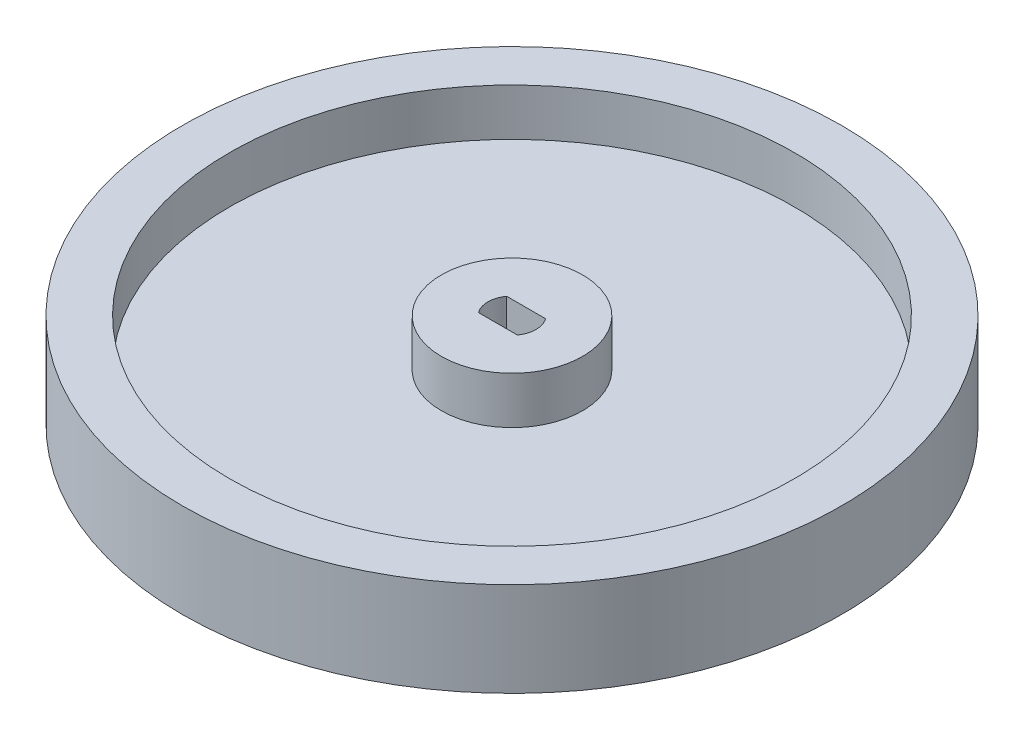
ISO-10303-21;
HEADER;
FILE_DESCRIPTION(('STEP AP214'),'2;1');
FILE_NAME('part.step','',(''),(''),'','','');
FILE_SCHEMA(('AUTOMOTIVE_DESIGN { 1 0 10303 214 1 1 1 1 }'));
ENDSEC;
DATA;
#1=APPLICATION_CONTEXT('core data for automotive mechanical design processes');
#2=APPLICATION_PROTOCOL_DEFINITION('international standard','automotive_design',2000,#1);
#3=PRODUCT_CONTEXT('',#1,'mechanical');
#4=PRODUCT('Part','Part','',(#3));
#5=PRODUCT_RELATED_PRODUCT_CATEGORY('part','',(#4));
#6=PRODUCT_DEFINITION_FORMATION('','',#4);
#7=PRODUCT_DEFINITION_CONTEXT('part definition',#1,'design');
#8=PRODUCT_DEFINITION('design','',#6,#7);
#9=PRODUCT_DEFINITION_SHAPE('','',#8);
#10=(LENGTH_UNIT() NAMED_UNIT(*) SI_UNIT(.MILLI.,.METRE.));
#11=(NAMED_UNIT(*) PLANE_ANGLE_UNIT() SI_UNIT($,.RADIAN.));
#12=(NAMED_UNIT(*) SI_UNIT($,.STERADIAN.) SOLID_ANGLE_UNIT());
#13=UNCERTAINTY_MEASURE_WITH_UNIT(LENGTH_MEASURE(1.E-05),#10,'distance_accuracy_value','');
#14=(GEOMETRIC_REPRESENTATION_CONTEXT(3) GLOBAL_UNCERTAINTY_ASSIGNED_CONTEXT((#13)) GLOBAL_UNIT_ASSIGNED_CONTEXT((#10,
#11,#12)) REPRESENTATION_CONTEXT('',''));
#15=CARTESIAN_POINT('',(0.,0.,0.));
#16=DIRECTION('',(0.,0.,1.));
#17=DIRECTION('',(1.,0.,0.));
#18=AXIS2_PLACEMENT_3D('',#15,#16,#17);
#19=CARTESIAN_POINT('',(0.,5.,0.));
#20=DIRECTION('',(0.,1.,0.));
#21=DIRECTION('',(0.,0.,1.));
#22=AXIS2_PLACEMENT_3D('',#19,#20,#21);
#23=PLANE('',#22);
#24=CARTESIAN_POINT('',(0.,5.,0.));
#25=DIRECTION('',(0.,1.,0.));
#26=DIRECTION('',(0.,0.,1.));
#27=AXIS2_PLACEMENT_3D('',#24,#25,#26);
#28=CIRCLE('',#27,7.5);
#29=CARTESIAN_POINT('',(0.,5.,7.5));
#30=VERTEX_POINT('',#29);
#31=EDGE_CURVE('E41',#30,#30,#28,.T.);
#32=ORIENTED_EDGE('',*,*,#31,.F.);
#33=EDGE_LOOP('',(#32));
#34=FACE_BOUND('',#33,.T.);
#35=CARTESIAN_POINT('',(0.,5.,0.));
#36=DIRECTION('',(0.,1.,0.));
#37=DIRECTION('',(0.,0.,1.));
#38=AXIS2_PLACEMENT_3D('',#35,#36,#37);
#39=CIRCLE('',#38,30.);
#40=CARTESIAN_POINT('',(0.,5.,30.));
#41=VERTEX_POINT('',#40);
#42=EDGE_CURVE('E11',#41,#41,#39,.F.);
#43=ORIENTED_EDGE('',*,*,#42,.F.);
#44=EDGE_LOOP('',(#43));
#45=FACE_BOUND('',#44,.T.);
#46=ADVANCED_FACE('F33',(#34,#45),#23,.T.);
#47=CARTESIAN_POINT('',(0.,1.,0.));
#48=DIRECTION('',(0.,1.,0.));
#49=DIRECTION('',(0.,0.,1.));
#50=AXIS2_PLACEMENT_3D('',#47,#48,#49);
#51=PLANE('',#50);
#52=CARTESIAN_POINT('',(0.,1.,0.));
#53=DIRECTION('',(0.,1.,0.));
#54=DIRECTION('',(0.,0.,1.));
#55=AXIS2_PLACEMENT_3D('',#52,#53,#54);
#56=CIRCLE('',#55,1.5);
#57=CARTESIAN_POINT('',(0.,1.,1.5));
#58=VERTEX_POINT('',#57);
#59=CARTESIAN_POINT('',(0.,1.,-1.5));
#60=VERTEX_POINT('',#59);
#61=EDGE_CURVE('E47',#58,#60,#56,.T.);
#62=ORIENTED_EDGE('',*,*,#61,.F.);
#63=DIRECTION('',(1.,0.,0.));
#64=VECTOR('',#63,1.);
#65=CARTESIAN_POINT('',(-2.06215906273013,1.,1.5));
#66=LINE('',#65,#64);
#67=CARTESIAN_POINT('',(2.06215906273013,1.,1.5));
#68=VERTEX_POINT('',#67);
#69=EDGE_CURVE('E90',#58,#68,#66,.T.);
#70=ORIENTED_EDGE('',*,*,#69,.T.);
#71=CARTESIAN_POINT('',(0.,1.,0.));
#72=DIRECTION('',(0.,1.,0.));
#73=DIRECTION('',(0.,0.,1.));
#74=AXIS2_PLACEMENT_3D('',#71,#72,#73);
#75=CIRCLE('',#74,2.55);
#76=CARTESIAN_POINT('',(2.06215906273013,1.,-1.5));
#77=VERTEX_POINT('',#76);
#78=EDGE_CURVE('E107',#68,#77,#75,.T.);
#79=ORIENTED_EDGE('',*,*,#78,.T.);
#80=DIRECTION('',(-1.,0.,0.));
#81=VECTOR('',#80,1.);
#82=CARTESIAN_POINT('',(-2.06215906273013,1.,-1.5));
#83=LINE('',#82,#81);
#84=EDGE_CURVE('E92',#77,#60,#83,.T.);
#85=ORIENTED_EDGE('',*,*,#84,.T.);
#86=EDGE_LOOP('',(#62,#70,#79,#85));
#87=FACE_BOUND('',#86,.T.);
#88=ADVANCED_FACE('F88',(#87),#51,.T.);
#89=CARTESIAN_POINT('',(0.,5.,0.));
#90=DIRECTION('',(0.,-1.,0.));
#91=DIRECTION('',(0.,0.,-1.));
#92=AXIS2_PLACEMENT_3D('',#89,#90,#91);
#93=CYLINDRICAL_SURFACE('',#92,35.);
#94=CARTESIAN_POINT('',(0.,0.,0.));
#95=DIRECTION('',(0.,1.,0.));
#96=DIRECTION('',(0.,0.,1.));
#97=AXIS2_PLACEMENT_3D('',#94,#95,#96);
#98=CIRCLE('',#97,35.);
#99=CARTESIAN_POINT('',(0.,0.,35.));
#100=VERTEX_POINT('',#99);
#101=EDGE_CURVE('E131',#100,#100,#98,.T.);
#102=ORIENTED_EDGE('',*,*,#101,.T.);
#103=EDGE_LOOP('',(#102));
#104=FACE_BOUND('',#103,.T.);
#105=CARTESIAN_POINT('',(0.,10.,0.));
#106=DIRECTION('',(0.,1.,0.));
#107=DIRECTION('',(0.,0.,1.));
#108=AXIS2_PLACEMENT_3D('',#105,#106,#107);
#109=CIRCLE('',#108,35.);
#110=CARTESIAN_POINT('',(0.,10.,35.));
#111=VERTEX_POINT('',#110);
#112=EDGE_CURVE('E83',#111,#111,#109,.T.);
#113=ORIENTED_EDGE('',*,*,#112,.F.);
#114=EDGE_LOOP('',(#113));
#115=FACE_BOUND('',#114,.T.);
#116=ADVANCED_FACE('F35',(#104,#115),#93,.T.);
#117=CARTESIAN_POINT('',(0.,0.,0.));
#118=DIRECTION('',(0.,1.,0.));
#119=DIRECTION('',(0.,0.,1.));
#120=AXIS2_PLACEMENT_3D('',#117,#118,#119);
#121=PLANE('',#120);
#122=CARTESIAN_POINT('',(0.,0.,0.));
#123=DIRECTION('',(0.,1.,0.));
#124=DIRECTION('',(0.,0.,1.));
#125=AXIS2_PLACEMENT_3D('',#122,#123,#124);
#126=CIRCLE('',#125,1.5);
#127=CARTESIAN_POINT('',(0.,0.,1.5));
#128=VERTEX_POINT('',#127);
#129=EDGE_CURVE('E93',#128,#128,#126,.T.);
#130=ORIENTED_EDGE('',*,*,#129,.T.);
#131=EDGE_LOOP('',(#130));
#132=FACE_BOUND('',#131,.T.);
#133=ORIENTED_EDGE('',*,*,#101,.F.);
#134=EDGE_LOOP('',(#133));
#135=FACE_BOUND('',#134,.T.);
#136=ADVANCED_FACE('F138',(#132,#135),#121,.F.);
#137=CARTESIAN_POINT('',(0.,10.,0.));
#138=DIRECTION('',(0.,1.,0.));
#139=DIRECTION('',(0.,0.,1.));
#140=AXIS2_PLACEMENT_3D('',#137,#138,#139);
#141=PLANE('',#140);
#142=CARTESIAN_POINT('',(0.,10.,0.));
#143=DIRECTION('',(0.,1.,0.));
#144=DIRECTION('',(0.,0.,1.));
#145=AXIS2_PLACEMENT_3D('',#142,#143,#144);
#146=CIRCLE('',#145,7.5);
#147=CARTESIAN_POINT('',(0.,10.,7.5));
#148=VERTEX_POINT('',#147);
#149=EDGE_CURVE('E128',#148,#148,#146,.T.);
#150=ORIENTED_EDGE('',*,*,#149,.T.);
#151=EDGE_LOOP('',(#150));
#152=FACE_BOUND('',#151,.T.);
#153=DIRECTION('',(1.,0.,0.));
#154=VECTOR('',#153,1.);
#155=CARTESIAN_POINT('',(-2.06215906273013,10.,1.5));
#156=LINE('',#155,#154);
#157=CARTESIAN_POINT('',(-2.06215906273013,10.,1.5));
#158=VERTEX_POINT('',#157);
#159=CARTESIAN_POINT('',(2.06215906273013,10.,1.5));
#160=VERTEX_POINT('',#159);
#161=EDGE_CURVE('E115',#158,#160,#156,.T.);
#162=ORIENTED_EDGE('',*,*,#161,.F.);
#163=CARTESIAN_POINT('',(0.,10.,0.));
#164=DIRECTION('',(0.,1.,0.));
#165=DIRECTION('',(0.,0.,1.));
#166=AXIS2_PLACEMENT_3D('',#163,#164,#165);
#167=CIRCLE('',#166,2.55);
#168=CARTESIAN_POINT('',(-2.06215906273013,10.,-1.5));
#169=VERTEX_POINT('',#168);
#170=EDGE_CURVE('E113',#169,#158,#167,.T.);
#171=ORIENTED_EDGE('',*,*,#170,.F.);
#172=DIRECTION('',(-1.,0.,0.));
#173=VECTOR('',#172,1.);
#174=CARTESIAN_POINT('',(-2.06215906273013,10.,-1.5));
#175=LINE('',#174,#173);
#176=CARTESIAN_POINT('',(2.06215906273013,10.,-1.5));
#177=VERTEX_POINT('',#176);
#178=EDGE_CURVE('E119',#177,#169,#175,.T.);
#179=ORIENTED_EDGE('',*,*,#178,.F.);
#180=CARTESIAN_POINT('',(0.,10.,0.));
#181=DIRECTION('',(0.,1.,0.));
#182=DIRECTION('',(0.,0.,1.));
#183=AXIS2_PLACEMENT_3D('',#180,#181,#182);
#184=CIRCLE('',#183,2.55);
#185=EDGE_CURVE('E117',#160,#177,#184,.T.);
#186=ORIENTED_EDGE('',*,*,#185,.F.);
#187=EDGE_LOOP('',(#162,#171,#179,#186));
#188=FACE_BOUND('',#187,.T.);
#189=ADVANCED_FACE('F164',(#152,#188),#141,.T.);
#190=CARTESIAN_POINT('',(0.,10.,0.));
#191=DIRECTION('',(0.,-1.,0.));
#192=DIRECTION('',(0.,0.,-1.));
#193=AXIS2_PLACEMENT_3D('',#190,#191,#192);
#194=CYLINDRICAL_SURFACE('',#193,7.5);
#195=ORIENTED_EDGE('',*,*,#149,.F.);
#196=EDGE_LOOP('',(#195));
#197=FACE_BOUND('',#196,.T.);
#198=ORIENTED_EDGE('',*,*,#31,.T.);
#199=EDGE_LOOP('',(#198));
#200=FACE_BOUND('',#199,.T.);
#201=ADVANCED_FACE('F161',(#197,#200),#194,.T.);
#202=CARTESIAN_POINT('',(0.,10.,0.));
#203=DIRECTION('',(0.,-1.,0.));
#204=DIRECTION('',(0.,0.,-1.));
#205=AXIS2_PLACEMENT_3D('',#202,#203,#204);
#206=CYLINDRICAL_SURFACE('',#205,2.55);
#207=DIRECTION('',(0.,-1.,0.));
#208=VECTOR('',#207,1.);
#209=CARTESIAN_POINT('',(-2.06215906273013,10.,1.5));
#210=LINE('',#209,#208);
#211=CARTESIAN_POINT('',(-2.06215906273013,1.,1.5));
#212=VERTEX_POINT('',#211);
#213=EDGE_CURVE('E126',#158,#212,#210,.T.);
#214=ORIENTED_EDGE('',*,*,#213,.T.);
#215=CARTESIAN_POINT('',(0.,1.,0.));
#216=DIRECTION('',(0.,1.,0.));
#217=DIRECTION('',(0.,0.,1.));
#218=AXIS2_PLACEMENT_3D('',#215,#216,#217);
#219=CIRCLE('',#218,2.55);
#220=CARTESIAN_POINT('',(-2.06215906273013,1.,-1.5));
#221=VERTEX_POINT('',#220);
#222=EDGE_CURVE('E103',#221,#212,#219,.T.);
#223=ORIENTED_EDGE('',*,*,#222,.F.);
#224=DIRECTION('',(0.,-1.,0.));
#225=VECTOR('',#224,1.);
#226=CARTESIAN_POINT('',(-2.06215906273013,10.,-1.5));
#227=LINE('',#226,#225);
#228=EDGE_CURVE('E121',#169,#221,#227,.T.);
#229=ORIENTED_EDGE('',*,*,#228,.F.);
#230=ORIENTED_EDGE('',*,*,#170,.T.);
#231=EDGE_LOOP('',(#214,#223,#229,#230));
#232=FACE_BOUND('',#231,.T.);
#233=ADVANCED_FACE('F234',(#232),#206,.F.);
#234=CARTESIAN_POINT('',(-2.06215906273013,10.,1.5));
#235=DIRECTION('',(0.,0.,-1.));
#236=DIRECTION('',(-1.,0.,0.));
#237=AXIS2_PLACEMENT_3D('',#234,#235,#236);
#238=PLANE('',#237);
#239=DIRECTION('',(0.,-1.,0.));
#240=VECTOR('',#239,1.);
#241=CARTESIAN_POINT('',(2.06215906273013,10.,1.5));
#242=LINE('',#241,#240);
#243=EDGE_CURVE('E101',#160,#68,#242,.T.);
#244=ORIENTED_EDGE('',*,*,#243,.T.);
#245=ORIENTED_EDGE('',*,*,#69,.F.);
#246=EDGE_CURVE('E98',#212,#58,#66,.T.);
#247=ORIENTED_EDGE('',*,*,#246,.F.);
#248=ORIENTED_EDGE('',*,*,#213,.F.);
#249=ORIENTED_EDGE('',*,*,#161,.T.);
#250=EDGE_LOOP('',(#244,#245,#247,#248,#249));
#251=FACE_BOUND('',#250,.T.);
#252=ADVANCED_FACE('F96',(#251),#238,.T.);
#253=CARTESIAN_POINT('',(0.,10.,0.));
#254=DIRECTION('',(0.,-1.,0.));
#255=DIRECTION('',(0.,0.,-1.));
#256=AXIS2_PLACEMENT_3D('',#253,#254,#255);
#257=CYLINDRICAL_SURFACE('',#256,2.55);
#258=DIRECTION('',(0.,-1.,0.));
#259=VECTOR('',#258,1.);
#260=CARTESIAN_POINT('',(2.06215906273013,10.,-1.5));
#261=LINE('',#260,#259);
#262=EDGE_CURVE('E55',#177,#77,#261,.T.);
#263=ORIENTED_EDGE('',*,*,#262,.T.);
#264=ORIENTED_EDGE('',*,*,#78,.F.);
#265=ORIENTED_EDGE('',*,*,#243,.F.);
#266=ORIENTED_EDGE('',*,*,#185,.T.);
#267=EDGE_LOOP('',(#263,#264,#265,#266));
#268=FACE_BOUND('',#267,.T.);
#269=ADVANCED_FACE('F223',(#268),#257,.F.);
#270=CARTESIAN_POINT('',(-2.06215906273013,10.,-1.5));
#271=DIRECTION('',(0.,0.,1.));
#272=DIRECTION('',(1.,0.,0.));
#273=AXIS2_PLACEMENT_3D('',#270,#271,#272);
#274=PLANE('',#273);
#275=ORIENTED_EDGE('',*,*,#228,.T.);
#276=EDGE_CURVE('E108',#60,#221,#83,.T.);
#277=ORIENTED_EDGE('',*,*,#276,.F.);
#278=ORIENTED_EDGE('',*,*,#84,.F.);
#279=ORIENTED_EDGE('',*,*,#262,.F.);
#280=ORIENTED_EDGE('',*,*,#178,.T.);
#281=EDGE_LOOP('',(#275,#277,#278,#279,#280));
#282=FACE_BOUND('',#281,.T.);
#283=ADVANCED_FACE('F150',(#282),#274,.T.);
#284=EDGE_CURVE('E77',#60,#58,#56,.T.);
#285=ORIENTED_EDGE('',*,*,#284,.F.);
#286=ORIENTED_EDGE('',*,*,#276,.T.);
#287=ORIENTED_EDGE('',*,*,#222,.T.);
#288=ORIENTED_EDGE('',*,*,#246,.T.);
#289=EDGE_LOOP('',(#285,#286,#287,#288));
#290=FACE_BOUND('',#289,.T.);
#291=ADVANCED_FACE('F105',(#290),#51,.T.);
#292=CARTESIAN_POINT('',(0.,-3.,0.));
#293=DIRECTION('',(0.,1.,0.));
#294=DIRECTION('',(0.,0.,1.));
#295=AXIS2_PLACEMENT_3D('',#292,#293,#294);
#296=CYLINDRICAL_SURFACE('',#295,1.5);
#297=ORIENTED_EDGE('',*,*,#61,.T.);
#298=ORIENTED_EDGE('',*,*,#284,.T.);
#299=EDGE_LOOP('',(#297,#298));
#300=FACE_BOUND('',#299,.T.);
#301=ORIENTED_EDGE('',*,*,#129,.F.);
#302=EDGE_LOOP('',(#301));
#303=FACE_BOUND('',#302,.T.);
#304=ADVANCED_FACE('F78',(#300,#303),#296,.F.);
#305=CARTESIAN_POINT('',(0.,10.,0.));
#306=DIRECTION('',(0.,1.,0.));
#307=DIRECTION('',(0.,0.,1.));
#308=AXIS2_PLACEMENT_3D('',#305,#306,#307);
#309=PLANE('',#308);
#310=ORIENTED_EDGE('',*,*,#112,.T.);
#311=EDGE_LOOP('',(#310));
#312=FACE_BOUND('',#311,.T.);
#313=CARTESIAN_POINT('',(0.,10.,0.));
#314=DIRECTION('',(0.,1.,0.));
#315=DIRECTION('',(0.,0.,1.));
#316=AXIS2_PLACEMENT_3D('',#313,#314,#315);
#317=CIRCLE('',#316,30.);
#318=CARTESIAN_POINT('',(0.,10.,30.));
#319=VERTEX_POINT('',#318);
#320=EDGE_CURVE('E177',#319,#319,#317,.T.);
#321=ORIENTED_EDGE('',*,*,#320,.F.);
#322=EDGE_LOOP('',(#321));
#323=FACE_BOUND('',#322,.T.);
#324=ADVANCED_FACE('F141',(#312,#323),#309,.T.);
#325=CARTESIAN_POINT('',(0.,10.,0.));
#326=DIRECTION('',(0.,-1.,0.));
#327=DIRECTION('',(0.,0.,-1.));
#328=AXIS2_PLACEMENT_3D('',#325,#326,#327);
#329=CYLINDRICAL_SURFACE('',#328,30.);
#330=ORIENTED_EDGE('',*,*,#320,.T.);
#331=EDGE_LOOP('',(#330));
#332=FACE_BOUND('',#331,.T.);
#333=ORIENTED_EDGE('',*,*,#42,.T.);
#334=EDGE_LOOP('',(#333));
#335=FACE_BOUND('',#334,.T.);
#336=ADVANCED_FACE('F147',(#332,#335),#329,.F.);
#337=CLOSED_SHELL('',(#46,#88,#116,#136,#189,#201,#233,#252,#269,#283,#291,#304,#324,#336));
#338=MANIFOLD_SOLID_BREP('B2',#337);
#339=ADVANCED_BREP_SHAPE_REPRESENTATION('',(#18,#338),#14);
#340=SHAPE_DEFINITION_REPRESENTATION(#9,#339);
ENDSEC;
END-ISO-10303-21;
